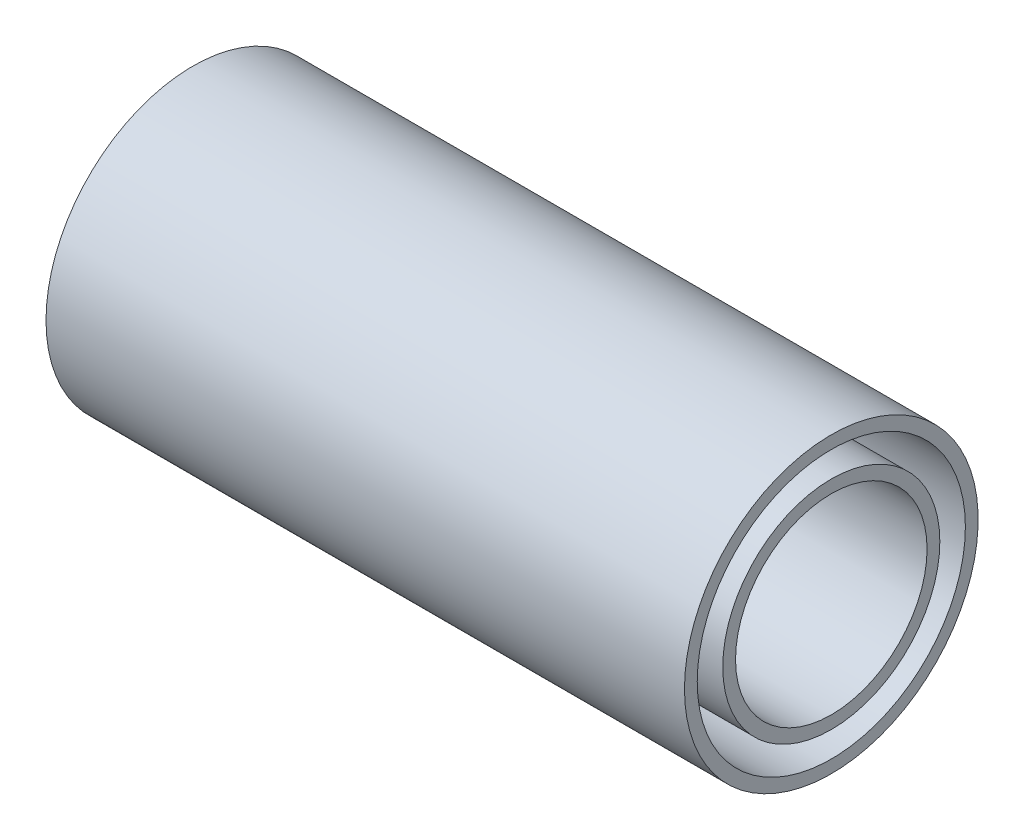
ISO-10303-21;
HEADER;
FILE_DESCRIPTION(('STEP AP214'),'2;1');
FILE_NAME('part.step','',(''),(''),'','','');
FILE_SCHEMA(('AUTOMOTIVE_DESIGN { 1 0 10303 214 1 1 1 1 }'));
ENDSEC;
DATA;
#1=APPLICATION_CONTEXT('core data for automotive mechanical design processes');
#2=APPLICATION_PROTOCOL_DEFINITION('international standard','automotive_design',2000,#1);
#3=PRODUCT_CONTEXT('',#1,'mechanical');
#4=PRODUCT('Part','Part','',(#3));
#5=PRODUCT_RELATED_PRODUCT_CATEGORY('part','',(#4));
#6=PRODUCT_DEFINITION_FORMATION('','',#4);
#7=PRODUCT_DEFINITION_CONTEXT('part definition',#1,'design');
#8=PRODUCT_DEFINITION('design','',#6,#7);
#9=PRODUCT_DEFINITION_SHAPE('','',#8);
#10=(LENGTH_UNIT() NAMED_UNIT(*) SI_UNIT(.MILLI.,.METRE.));
#11=(NAMED_UNIT(*) PLANE_ANGLE_UNIT() SI_UNIT($,.RADIAN.));
#12=(NAMED_UNIT(*) SI_UNIT($,.STERADIAN.) SOLID_ANGLE_UNIT());
#13=UNCERTAINTY_MEASURE_WITH_UNIT(LENGTH_MEASURE(1.E-05),#10,'distance_accuracy_value','');
#14=(GEOMETRIC_REPRESENTATION_CONTEXT(3) GLOBAL_UNCERTAINTY_ASSIGNED_CONTEXT((#13)) GLOBAL_UNIT_ASSIGNED_CONTEXT((#10,
#11,#12)) REPRESENTATION_CONTEXT('',''));
#15=CARTESIAN_POINT('',(0.,0.,0.));
#16=DIRECTION('',(0.,0.,1.));
#17=DIRECTION('',(1.,0.,0.));
#18=AXIS2_PLACEMENT_3D('',#15,#16,#17);
#19=CARTESIAN_POINT('',(0.,0.,0.));
#20=DIRECTION('',(-1.,0.,0.));
#21=DIRECTION('',(0.,0.,1.));
#22=AXIS2_PLACEMENT_3D('',#19,#20,#21);
#23=CYLINDRICAL_SURFACE('',#22,29.21);
#24=CARTESIAN_POINT('',(0.,0.,0.));
#25=DIRECTION('',(-1.,0.,0.));
#26=DIRECTION('',(0.,0.,1.));
#27=AXIS2_PLACEMENT_3D('',#24,#25,#26);
#28=CIRCLE('',#27,29.21);
#29=CARTESIAN_POINT('',(0.,0.,29.21));
#30=VERTEX_POINT('',#29);
#31=EDGE_CURVE('E11',#30,#30,#28,.T.);
#32=ORIENTED_EDGE('',*,*,#31,.F.);
#33=EDGE_LOOP('',(#32));
#34=FACE_BOUND('',#33,.T.);
#35=CARTESIAN_POINT('',(127.,0.,0.));
#36=DIRECTION('',(-1.,0.,0.));
#37=DIRECTION('',(0.,0.,1.));
#38=AXIS2_PLACEMENT_3D('',#35,#36,#37);
#39=CIRCLE('',#38,29.21);
#40=CARTESIAN_POINT('',(127.,0.,29.21));
#41=VERTEX_POINT('',#40);
#42=EDGE_CURVE('E57',#41,#41,#39,.T.);
#43=ORIENTED_EDGE('',*,*,#42,.T.);
#44=EDGE_LOOP('',(#43));
#45=FACE_BOUND('',#44,.T.);
#46=ADVANCED_FACE('F43',(#34,#45),#23,.T.);
#47=CARTESIAN_POINT('',(0.,0.,0.));
#48=DIRECTION('',(1.,0.,0.));
#49=DIRECTION('',(0.,0.,-1.));
#50=AXIS2_PLACEMENT_3D('',#47,#48,#49);
#51=PLANE('',#50);
#52=CARTESIAN_POINT('',(0.,0.,0.));
#53=DIRECTION('',(-1.,0.,0.));
#54=DIRECTION('',(0.,0.,1.));
#55=AXIS2_PLACEMENT_3D('',#52,#53,#54);
#56=CIRCLE('',#55,26.67);
#57=CARTESIAN_POINT('',(0.,0.,26.67));
#58=VERTEX_POINT('',#57);
#59=EDGE_CURVE('E49',#58,#58,#56,.T.);
#60=ORIENTED_EDGE('',*,*,#59,.F.);
#61=EDGE_LOOP('',(#60));
#62=FACE_BOUND('',#61,.T.);
#63=ORIENTED_EDGE('',*,*,#31,.T.);
#64=EDGE_LOOP('',(#63));
#65=FACE_BOUND('',#64,.T.);
#66=ADVANCED_FACE('F72',(#62,#65),#51,.F.);
#67=CARTESIAN_POINT('',(0.,0.,0.));
#68=DIRECTION('',(-1.,0.,0.));
#69=DIRECTION('',(0.,0.,1.));
#70=AXIS2_PLACEMENT_3D('',#67,#68,#69);
#71=CYLINDRICAL_SURFACE('',#70,26.67);
#72=CARTESIAN_POINT('',(127.,0.,0.));
#73=DIRECTION('',(-1.,0.,0.));
#74=DIRECTION('',(0.,0.,1.));
#75=AXIS2_PLACEMENT_3D('',#72,#73,#74);
#76=CIRCLE('',#75,26.67);
#77=CARTESIAN_POINT('',(127.,0.,26.67));
#78=VERTEX_POINT('',#77);
#79=EDGE_CURVE('E53',#78,#78,#76,.T.);
#80=ORIENTED_EDGE('',*,*,#79,.F.);
#81=EDGE_LOOP('',(#80));
#82=FACE_BOUND('',#81,.T.);
#83=ORIENTED_EDGE('',*,*,#59,.T.);
#84=EDGE_LOOP('',(#83));
#85=FACE_BOUND('',#84,.T.);
#86=ADVANCED_FACE('F67',(#82,#85),#71,.F.);
#87=CARTESIAN_POINT('',(127.,0.,0.));
#88=DIRECTION('',(-1.,0.,0.));
#89=DIRECTION('',(0.,0.,1.));
#90=AXIS2_PLACEMENT_3D('',#87,#88,#89);
#91=PLANE('',#90);
#92=ORIENTED_EDGE('',*,*,#42,.F.);
#93=EDGE_LOOP('',(#92));
#94=FACE_BOUND('',#93,.T.);
#95=ORIENTED_EDGE('',*,*,#79,.T.);
#96=EDGE_LOOP('',(#95));
#97=FACE_BOUND('',#96,.T.);
#98=ADVANCED_FACE('F64',(#94,#97),#91,.F.);
#99=CLOSED_SHELL('',(#46,#66,#86,#98));
#100=MANIFOLD_SOLID_BREP('B2',#99);
#101=CARTESIAN_POINT('',(127.,0.,0.));
#102=DIRECTION('',(1.,0.,0.));
#103=DIRECTION('',(0.,0.,-1.));
#104=AXIS2_PLACEMENT_3D('',#101,#102,#103);
#105=PLANE('',#104);
#106=CARTESIAN_POINT('',(127.,0.,0.));
#107=DIRECTION('',(-1.,0.,0.));
#108=DIRECTION('',(0.,0.,1.));
#109=AXIS2_PLACEMENT_3D('',#106,#107,#108);
#110=CIRCLE('',#109,19.05);
#111=CARTESIAN_POINT('',(127.,0.,19.05));
#112=VERTEX_POINT('',#111);
#113=EDGE_CURVE('E127',#112,#112,#110,.T.);
#114=ORIENTED_EDGE('',*,*,#113,.T.);
#115=EDGE_LOOP('',(#114));
#116=FACE_BOUND('',#115,.T.);
#117=CARTESIAN_POINT('',(127.,0.,0.));
#118=DIRECTION('',(-1.,0.,0.));
#119=DIRECTION('',(0.,0.,1.));
#120=AXIS2_PLACEMENT_3D('',#117,#118,#119);
#121=CIRCLE('',#120,21.59);
#122=CARTESIAN_POINT('',(127.,0.,21.59));
#123=VERTEX_POINT('',#122);
#124=EDGE_CURVE('E42',#123,#123,#121,.T.);
#125=ORIENTED_EDGE('',*,*,#124,.F.);
#126=EDGE_LOOP('',(#125));
#127=FACE_BOUND('',#126,.T.);
#128=ADVANCED_FACE('F113',(#116,#127),#105,.T.);
#129=CARTESIAN_POINT('',(0.,0.,0.));
#130=DIRECTION('',(-1.,0.,0.));
#131=DIRECTION('',(0.,0.,1.));
#132=AXIS2_PLACEMENT_3D('',#129,#130,#131);
#133=CYLINDRICAL_SURFACE('',#132,21.59);
#134=ORIENTED_EDGE('',*,*,#124,.T.);
#135=EDGE_LOOP('',(#134));
#136=FACE_BOUND('',#135,.T.);
#137=CARTESIAN_POINT('',(0.,0.,0.));
#138=DIRECTION('',(-1.,0.,0.));
#139=DIRECTION('',(0.,0.,1.));
#140=AXIS2_PLACEMENT_3D('',#137,#138,#139);
#141=CIRCLE('',#140,21.59);
#142=CARTESIAN_POINT('',(0.,0.,21.59));
#143=VERTEX_POINT('',#142);
#144=EDGE_CURVE('E119',#143,#143,#141,.T.);
#145=ORIENTED_EDGE('',*,*,#144,.F.);
#146=EDGE_LOOP('',(#145));
#147=FACE_BOUND('',#146,.T.);
#148=ADVANCED_FACE('F143',(#136,#147),#133,.T.);
#149=CARTESIAN_POINT('',(0.,0.,0.));
#150=DIRECTION('',(-1.,0.,0.));
#151=DIRECTION('',(0.,0.,1.));
#152=AXIS2_PLACEMENT_3D('',#149,#150,#151);
#153=PLANE('',#152);
#154=ORIENTED_EDGE('',*,*,#144,.T.);
#155=EDGE_LOOP('',(#154));
#156=FACE_BOUND('',#155,.T.);
#157=CARTESIAN_POINT('',(0.,0.,0.));
#158=DIRECTION('',(-1.,0.,0.));
#159=DIRECTION('',(0.,0.,1.));
#160=AXIS2_PLACEMENT_3D('',#157,#158,#159);
#161=CIRCLE('',#160,19.05);
#162=CARTESIAN_POINT('',(0.,0.,19.05));
#163=VERTEX_POINT('',#162);
#164=EDGE_CURVE('E123',#163,#163,#161,.T.);
#165=ORIENTED_EDGE('',*,*,#164,.F.);
#166=EDGE_LOOP('',(#165));
#167=FACE_BOUND('',#166,.T.);
#168=ADVANCED_FACE('F138',(#156,#167),#153,.T.);
#169=CARTESIAN_POINT('',(0.,0.,0.));
#170=DIRECTION('',(-1.,0.,0.));
#171=DIRECTION('',(0.,0.,1.));
#172=AXIS2_PLACEMENT_3D('',#169,#170,#171);
#173=CYLINDRICAL_SURFACE('',#172,19.05);
#174=ORIENTED_EDGE('',*,*,#113,.F.);
#175=EDGE_LOOP('',(#174));
#176=FACE_BOUND('',#175,.T.);
#177=ORIENTED_EDGE('',*,*,#164,.T.);
#178=EDGE_LOOP('',(#177));
#179=FACE_BOUND('',#178,.T.);
#180=ADVANCED_FACE('F135',(#176,#179),#173,.F.);
#181=CLOSED_SHELL('',(#128,#148,#168,#180));
#182=MANIFOLD_SOLID_BREP('B6',#181);
#183=ADVANCED_BREP_SHAPE_REPRESENTATION('',(#18,#100,#182),#14);
#184=SHAPE_DEFINITION_REPRESENTATION(#9,#183);
ENDSEC;
END-ISO-10303-21;
